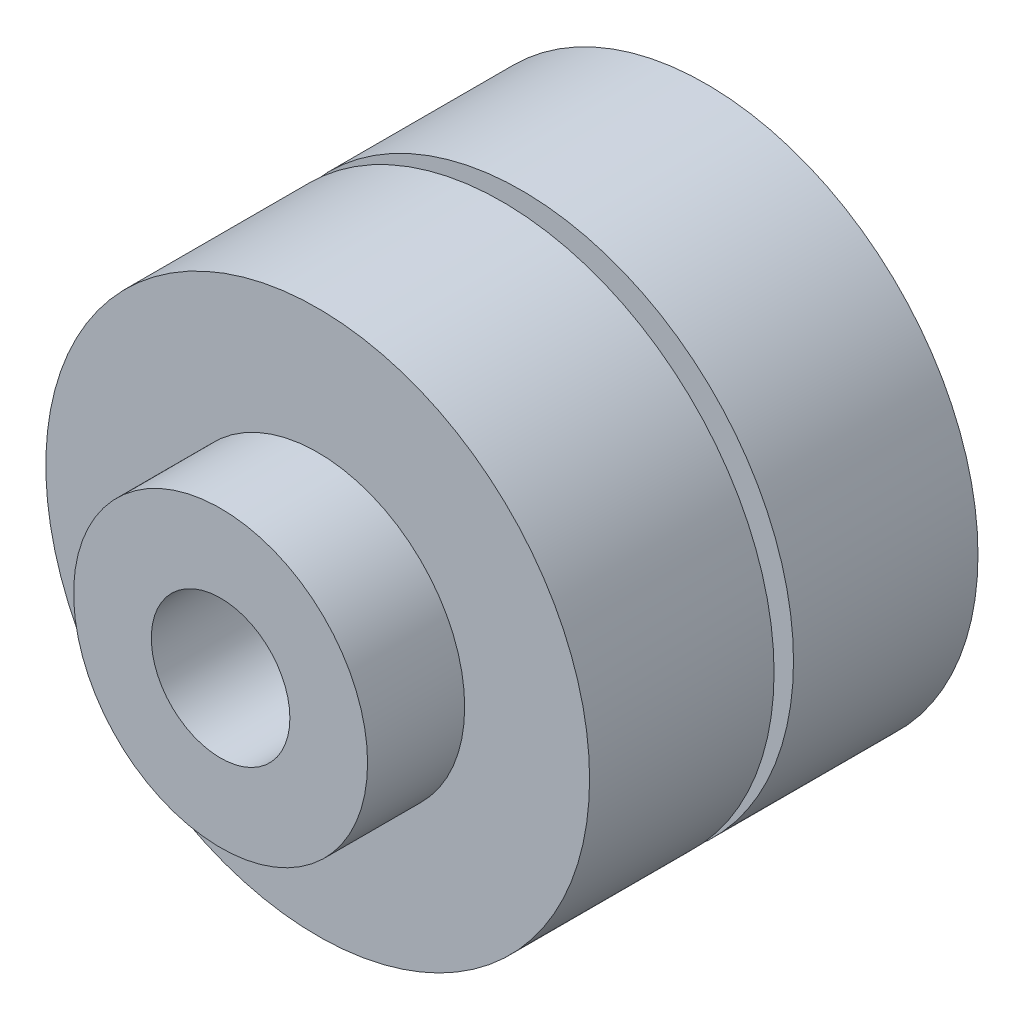
ISO-10303-21;
HEADER;
FILE_DESCRIPTION(('STEP AP214'),'2;1');
FILE_NAME('part.step','',(''),(''),'','','');
FILE_SCHEMA(('AUTOMOTIVE_DESIGN { 1 0 10303 214 1 1 1 1 }'));
ENDSEC;
DATA;
#1=APPLICATION_CONTEXT('core data for automotive mechanical design processes');
#2=APPLICATION_PROTOCOL_DEFINITION('international standard','automotive_design',2000,#1);
#3=PRODUCT_CONTEXT('',#1,'mechanical');
#4=PRODUCT('Part','Part','',(#3));
#5=PRODUCT_RELATED_PRODUCT_CATEGORY('part','',(#4));
#6=PRODUCT_DEFINITION_FORMATION('','',#4);
#7=PRODUCT_DEFINITION_CONTEXT('part definition',#1,'design');
#8=PRODUCT_DEFINITION('design','',#6,#7);
#9=PRODUCT_DEFINITION_SHAPE('','',#8);
#10=(LENGTH_UNIT() NAMED_UNIT(*) SI_UNIT(.MILLI.,.METRE.));
#11=(NAMED_UNIT(*) PLANE_ANGLE_UNIT() SI_UNIT($,.RADIAN.));
#12=(NAMED_UNIT(*) SI_UNIT($,.STERADIAN.) SOLID_ANGLE_UNIT());
#13=UNCERTAINTY_MEASURE_WITH_UNIT(LENGTH_MEASURE(1.E-05),#10,'distance_accuracy_value','');
#14=(GEOMETRIC_REPRESENTATION_CONTEXT(3) GLOBAL_UNCERTAINTY_ASSIGNED_CONTEXT((#13)) GLOBAL_UNIT_ASSIGNED_CONTEXT((#10,
#11,#12)) REPRESENTATION_CONTEXT('',''));
#15=CARTESIAN_POINT('',(0.,0.,0.));
#16=DIRECTION('',(0.,0.,1.));
#17=DIRECTION('',(1.,0.,0.));
#18=AXIS2_PLACEMENT_3D('',#15,#16,#17);
#19=CARTESIAN_POINT('',(-25.,0.,-60.));
#20=DIRECTION('',(0.,0.,1.));
#21=DIRECTION('',(1.,0.,0.));
#22=AXIS2_PLACEMENT_3D('',#19,#20,#21);
#23=PLANE('',#22);
#24=CARTESIAN_POINT('',(0.,0.,-60.));
#25=DIRECTION('',(0.,0.,1.));
#26=DIRECTION('',(1.,0.,0.));
#27=AXIS2_PLACEMENT_3D('',#24,#25,#26);
#28=CIRCLE('',#27,25.);
#29=CARTESIAN_POINT('',(25.,0.,-60.));
#30=VERTEX_POINT('',#29);
#31=EDGE_CURVE('E104',#30,#30,#28,.T.);
#32=ORIENTED_EDGE('',*,*,#31,.F.);
#33=EDGE_LOOP('',(#32));
#34=FACE_BOUND('',#33,.T.);
#35=CARTESIAN_POINT('',(0.,0.,-60.));
#36=DIRECTION('',(0.,0.,1.));
#37=DIRECTION('',(1.,0.,0.));
#38=AXIS2_PLACEMENT_3D('',#35,#36,#37);
#39=CIRCLE('',#38,5.00000000000009);
#40=CARTESIAN_POINT('',(5.00000000000009,0.,-60.));
#41=VERTEX_POINT('',#40);
#42=EDGE_CURVE('E10',#41,#41,#39,.T.);
#43=ORIENTED_EDGE('',*,*,#42,.T.);
#44=EDGE_LOOP('',(#43));
#45=FACE_BOUND('',#44,.T.);
#46=ADVANCED_FACE('F37',(#34,#45),#23,.F.);
#47=CARTESIAN_POINT('',(0.,0.,16.4130491248581));
#48=DIRECTION('',(0.,0.,1.));
#49=DIRECTION('',(1.,0.,0.));
#50=AXIS2_PLACEMENT_3D('',#47,#48,#49);
#51=CYLINDRICAL_SURFACE('',#50,5.00000000000009);
#52=ORIENTED_EDGE('',*,*,#42,.F.);
#53=EDGE_LOOP('',(#52));
#54=FACE_BOUND('',#53,.T.);
#55=CARTESIAN_POINT('',(0.,0.,-30.));
#56=DIRECTION('',(0.,0.,1.));
#57=DIRECTION('',(1.,0.,0.));
#58=AXIS2_PLACEMENT_3D('',#55,#56,#57);
#59=CIRCLE('',#58,5.0000000000001);
#60=CARTESIAN_POINT('',(5.0000000000001,0.,-30.));
#61=VERTEX_POINT('',#60);
#62=EDGE_CURVE('E44',#61,#61,#59,.T.);
#63=ORIENTED_EDGE('',*,*,#62,.T.);
#64=EDGE_LOOP('',(#63));
#65=FACE_BOUND('',#64,.T.);
#66=ADVANCED_FACE('F112',(#54,#65),#51,.F.);
#67=CARTESIAN_POINT('',(-5.0000000000001,0.,-30.));
#68=DIRECTION('',(0.,0.,-1.));
#69=DIRECTION('',(-1.,0.,0.));
#70=AXIS2_PLACEMENT_3D('',#67,#68,#69);
#71=PLANE('',#70);
#72=ORIENTED_EDGE('',*,*,#62,.F.);
#73=EDGE_LOOP('',(#72));
#74=FACE_BOUND('',#73,.T.);
#75=CARTESIAN_POINT('',(0.,0.,-30.));
#76=DIRECTION('',(0.,0.,1.));
#77=DIRECTION('',(1.,0.,0.));
#78=AXIS2_PLACEMENT_3D('',#75,#76,#77);
#79=CIRCLE('',#78,50.);
#80=CARTESIAN_POINT('',(50.,0.,-30.));
#81=VERTEX_POINT('',#80);
#82=EDGE_CURVE('E49',#81,#81,#79,.T.);
#83=ORIENTED_EDGE('',*,*,#82,.T.);
#84=EDGE_LOOP('',(#83));
#85=FACE_BOUND('',#84,.T.);
#86=ADVANCED_FACE('F116',(#74,#85),#71,.F.);
#87=CARTESIAN_POINT('',(0.,0.,16.4130491248581));
#88=DIRECTION('',(0.,0.,1.));
#89=DIRECTION('',(1.,0.,0.));
#90=AXIS2_PLACEMENT_3D('',#87,#88,#89);
#91=CYLINDRICAL_SURFACE('',#90,50.);
#92=ORIENTED_EDGE('',*,*,#82,.F.);
#93=EDGE_LOOP('',(#92));
#94=FACE_BOUND('',#93,.T.);
#95=CARTESIAN_POINT('',(0.,0.,30.));
#96=DIRECTION('',(0.,0.,1.));
#97=DIRECTION('',(1.,0.,0.));
#98=AXIS2_PLACEMENT_3D('',#95,#96,#97);
#99=CIRCLE('',#98,50.);
#100=CARTESIAN_POINT('',(50.,0.,30.));
#101=VERTEX_POINT('',#100);
#102=EDGE_CURVE('E54',#101,#101,#99,.T.);
#103=ORIENTED_EDGE('',*,*,#102,.T.);
#104=EDGE_LOOP('',(#103));
#105=FACE_BOUND('',#104,.T.);
#106=ADVANCED_FACE('F121',(#94,#105),#91,.F.);
#107=CARTESIAN_POINT('',(-50.,0.,30.));
#108=DIRECTION('',(0.,0.,1.));
#109=DIRECTION('',(1.,0.,0.));
#110=AXIS2_PLACEMENT_3D('',#107,#108,#109);
#111=PLANE('',#110);
#112=ORIENTED_EDGE('',*,*,#102,.F.);
#113=EDGE_LOOP('',(#112));
#114=FACE_BOUND('',#113,.T.);
#115=CARTESIAN_POINT('',(0.,0.,30.));
#116=DIRECTION('',(0.,0.,1.));
#117=DIRECTION('',(1.,0.,0.));
#118=AXIS2_PLACEMENT_3D('',#115,#116,#117);
#119=CIRCLE('',#118,17.8412411615277);
#120=CARTESIAN_POINT('',(17.8412411615277,0.,30.));
#121=VERTEX_POINT('',#120);
#122=EDGE_CURVE('E60',#121,#121,#119,.T.);
#123=ORIENTED_EDGE('',*,*,#122,.T.);
#124=EDGE_LOOP('',(#123));
#125=FACE_BOUND('',#124,.T.);
#126=ADVANCED_FACE('F127',(#114,#125),#111,.F.);
#127=CARTESIAN_POINT('',(0.,0.,16.4130491248581));
#128=DIRECTION('',(0.,0.,1.));
#129=DIRECTION('',(1.,0.,0.));
#130=AXIS2_PLACEMENT_3D('',#127,#128,#129);
#131=CYLINDRICAL_SURFACE('',#130,17.8412411615277);
#132=ORIENTED_EDGE('',*,*,#122,.F.);
#133=EDGE_LOOP('',(#132));
#134=FACE_BOUND('',#133,.T.);
#135=CARTESIAN_POINT('',(0.,0.,75.));
#136=DIRECTION('',(0.,0.,1.));
#137=DIRECTION('',(1.,0.,0.));
#138=AXIS2_PLACEMENT_3D('',#135,#136,#137);
#139=CIRCLE('',#138,17.8412411615276);
#140=CARTESIAN_POINT('',(17.8412411615276,0.,75.));
#141=VERTEX_POINT('',#140);
#142=EDGE_CURVE('E64',#141,#141,#139,.T.);
#143=ORIENTED_EDGE('',*,*,#142,.T.);
#144=EDGE_LOOP('',(#143));
#145=FACE_BOUND('',#144,.T.);
#146=ADVANCED_FACE('F131',(#134,#145),#131,.F.);
#147=CARTESIAN_POINT('',(-17.8412411615276,0.,75.));
#148=DIRECTION('',(0.,0.,-1.));
#149=DIRECTION('',(-1.,0.,0.));
#150=AXIS2_PLACEMENT_3D('',#147,#148,#149);
#151=PLANE('',#150);
#152=ORIENTED_EDGE('',*,*,#142,.F.);
#153=EDGE_LOOP('',(#152));
#154=FACE_BOUND('',#153,.T.);
#155=CARTESIAN_POINT('',(0.,0.,75.));
#156=DIRECTION('',(0.,0.,1.));
#157=DIRECTION('',(1.,0.,0.));
#158=AXIS2_PLACEMENT_3D('',#155,#156,#157);
#159=CIRCLE('',#158,37.8412411615276);
#160=CARTESIAN_POINT('',(37.8412411615276,0.,75.));
#161=VERTEX_POINT('',#160);
#162=EDGE_CURVE('E68',#161,#161,#159,.T.);
#163=ORIENTED_EDGE('',*,*,#162,.T.);
#164=EDGE_LOOP('',(#163));
#165=FACE_BOUND('',#164,.T.);
#166=ADVANCED_FACE('F135',(#154,#165),#151,.F.);
#167=CARTESIAN_POINT('',(0.,0.,16.4130491248581));
#168=DIRECTION('',(0.,0.,1.));
#169=DIRECTION('',(1.,0.,0.));
#170=AXIS2_PLACEMENT_3D('',#167,#168,#169);
#171=CYLINDRICAL_SURFACE('',#170,37.8412411615276);
#172=ORIENTED_EDGE('',*,*,#162,.F.);
#173=EDGE_LOOP('',(#172));
#174=FACE_BOUND('',#173,.T.);
#175=CARTESIAN_POINT('',(0.,0.,50.));
#176=DIRECTION('',(0.,0.,1.));
#177=DIRECTION('',(1.,0.,0.));
#178=AXIS2_PLACEMENT_3D('',#175,#176,#177);
#179=CIRCLE('',#178,37.8412411615276);
#180=CARTESIAN_POINT('',(37.8412411615276,0.,50.));
#181=VERTEX_POINT('',#180);
#182=EDGE_CURVE('E72',#181,#181,#179,.T.);
#183=ORIENTED_EDGE('',*,*,#182,.T.);
#184=EDGE_LOOP('',(#183));
#185=FACE_BOUND('',#184,.T.);
#186=ADVANCED_FACE('F139',(#174,#185),#171,.T.);
#187=CARTESIAN_POINT('',(-37.8412411615276,0.,50.));
#188=DIRECTION('',(0.,0.,-1.));
#189=DIRECTION('',(-1.,0.,0.));
#190=AXIS2_PLACEMENT_3D('',#187,#188,#189);
#191=PLANE('',#190);
#192=ORIENTED_EDGE('',*,*,#182,.F.);
#193=EDGE_LOOP('',(#192));
#194=FACE_BOUND('',#193,.T.);
#195=CARTESIAN_POINT('',(0.,0.,49.9999999999999));
#196=DIRECTION('',(0.,0.,1.));
#197=DIRECTION('',(1.,0.,0.));
#198=AXIS2_PLACEMENT_3D('',#195,#196,#197);
#199=CIRCLE('',#198,69.9999999999999);
#200=CARTESIAN_POINT('',(69.9999999999999,0.,49.9999999999999));
#201=VERTEX_POINT('',#200);
#202=EDGE_CURVE('E76',#201,#201,#199,.T.);
#203=ORIENTED_EDGE('',*,*,#202,.T.);
#204=EDGE_LOOP('',(#203));
#205=FACE_BOUND('',#204,.T.);
#206=ADVANCED_FACE('F143',(#194,#205),#191,.F.);
#207=CARTESIAN_POINT('',(0.,0.,16.4130491248581));
#208=DIRECTION('',(0.,0.,1.));
#209=DIRECTION('',(1.,0.,0.));
#210=AXIS2_PLACEMENT_3D('',#207,#208,#209);
#211=CYLINDRICAL_SURFACE('',#210,69.9999999999999);
#212=ORIENTED_EDGE('',*,*,#202,.F.);
#213=EDGE_LOOP('',(#212));
#214=FACE_BOUND('',#213,.T.);
#215=CARTESIAN_POINT('',(0.,0.,2.5));
#216=DIRECTION('',(0.,0.,1.));
#217=DIRECTION('',(1.,0.,0.));
#218=AXIS2_PLACEMENT_3D('',#215,#216,#217);
#219=CIRCLE('',#218,69.9999999999999);
#220=CARTESIAN_POINT('',(69.9999999999999,0.,2.5));
#221=VERTEX_POINT('',#220);
#222=EDGE_CURVE('E80',#221,#221,#219,.T.);
#223=ORIENTED_EDGE('',*,*,#222,.T.);
#224=EDGE_LOOP('',(#223));
#225=FACE_BOUND('',#224,.T.);
#226=ADVANCED_FACE('F147',(#214,#225),#211,.T.);
#227=CARTESIAN_POINT('',(-69.9999999999999,0.,2.5));
#228=DIRECTION('',(0.,0.,1.));
#229=DIRECTION('',(1.,0.,0.));
#230=AXIS2_PLACEMENT_3D('',#227,#228,#229);
#231=PLANE('',#230);
#232=ORIENTED_EDGE('',*,*,#222,.F.);
#233=EDGE_LOOP('',(#232));
#234=FACE_BOUND('',#233,.T.);
#235=CARTESIAN_POINT('',(0.,0.,2.5));
#236=DIRECTION('',(0.,0.,1.));
#237=DIRECTION('',(1.,0.,0.));
#238=AXIS2_PLACEMENT_3D('',#235,#236,#237);
#239=CIRCLE('',#238,55.);
#240=CARTESIAN_POINT('',(55.,0.,2.5));
#241=VERTEX_POINT('',#240);
#242=EDGE_CURVE('E84',#241,#241,#239,.T.);
#243=ORIENTED_EDGE('',*,*,#242,.T.);
#244=EDGE_LOOP('',(#243));
#245=FACE_BOUND('',#244,.T.);
#246=ADVANCED_FACE('F151',(#234,#245),#231,.F.);
#247=CARTESIAN_POINT('',(0.,0.,16.4130491248581));
#248=DIRECTION('',(0.,0.,1.));
#249=DIRECTION('',(1.,0.,0.));
#250=AXIS2_PLACEMENT_3D('',#247,#248,#249);
#251=CYLINDRICAL_SURFACE('',#250,55.);
#252=ORIENTED_EDGE('',*,*,#242,.F.);
#253=EDGE_LOOP('',(#252));
#254=FACE_BOUND('',#253,.T.);
#255=CARTESIAN_POINT('',(0.,0.,-2.5));
#256=DIRECTION('',(0.,0.,1.));
#257=DIRECTION('',(1.,0.,0.));
#258=AXIS2_PLACEMENT_3D('',#255,#256,#257);
#259=CIRCLE('',#258,55.);
#260=CARTESIAN_POINT('',(55.,0.,-2.5));
#261=VERTEX_POINT('',#260);
#262=EDGE_CURVE('E88',#261,#261,#259,.T.);
#263=ORIENTED_EDGE('',*,*,#262,.T.);
#264=EDGE_LOOP('',(#263));
#265=FACE_BOUND('',#264,.T.);
#266=ADVANCED_FACE('F155',(#254,#265),#251,.T.);
#267=CARTESIAN_POINT('',(-55.,0.,-2.5));
#268=DIRECTION('',(0.,0.,-1.));
#269=DIRECTION('',(-1.,0.,0.));
#270=AXIS2_PLACEMENT_3D('',#267,#268,#269);
#271=PLANE('',#270);
#272=ORIENTED_EDGE('',*,*,#262,.F.);
#273=EDGE_LOOP('',(#272));
#274=FACE_BOUND('',#273,.T.);
#275=CARTESIAN_POINT('',(0.,0.,-2.5));
#276=DIRECTION('',(0.,0.,1.));
#277=DIRECTION('',(1.,0.,0.));
#278=AXIS2_PLACEMENT_3D('',#275,#276,#277);
#279=CIRCLE('',#278,69.9999999999999);
#280=CARTESIAN_POINT('',(69.9999999999999,0.,-2.5));
#281=VERTEX_POINT('',#280);
#282=EDGE_CURVE('E92',#281,#281,#279,.T.);
#283=ORIENTED_EDGE('',*,*,#282,.T.);
#284=EDGE_LOOP('',(#283));
#285=FACE_BOUND('',#284,.T.);
#286=ADVANCED_FACE('F159',(#274,#285),#271,.F.);
#287=CARTESIAN_POINT('',(0.,0.,16.4130491248581));
#288=DIRECTION('',(0.,0.,1.));
#289=DIRECTION('',(1.,0.,0.));
#290=AXIS2_PLACEMENT_3D('',#287,#288,#289);
#291=CYLINDRICAL_SURFACE('',#290,69.9999999999999);
#292=ORIENTED_EDGE('',*,*,#282,.F.);
#293=EDGE_LOOP('',(#292));
#294=FACE_BOUND('',#293,.T.);
#295=CARTESIAN_POINT('',(0.,0.,-49.9999999999999));
#296=DIRECTION('',(0.,0.,1.));
#297=DIRECTION('',(1.,0.,0.));
#298=AXIS2_PLACEMENT_3D('',#295,#296,#297);
#299=CIRCLE('',#298,70.);
#300=CARTESIAN_POINT('',(70.,0.,-49.9999999999999));
#301=VERTEX_POINT('',#300);
#302=EDGE_CURVE('E96',#301,#301,#299,.T.);
#303=ORIENTED_EDGE('',*,*,#302,.T.);
#304=EDGE_LOOP('',(#303));
#305=FACE_BOUND('',#304,.T.);
#306=ADVANCED_FACE('F163',(#294,#305),#291,.T.);
#307=CARTESIAN_POINT('',(-70.,0.,-49.9999999999999));
#308=DIRECTION('',(0.,0.,1.));
#309=DIRECTION('',(1.,0.,0.));
#310=AXIS2_PLACEMENT_3D('',#307,#308,#309);
#311=PLANE('',#310);
#312=ORIENTED_EDGE('',*,*,#302,.F.);
#313=EDGE_LOOP('',(#312));
#314=FACE_BOUND('',#313,.T.);
#315=CARTESIAN_POINT('',(0.,0.,-49.9999999999999));
#316=DIRECTION('',(0.,0.,1.));
#317=DIRECTION('',(1.,0.,0.));
#318=AXIS2_PLACEMENT_3D('',#315,#316,#317);
#319=CIRCLE('',#318,25.);
#320=CARTESIAN_POINT('',(25.,0.,-49.9999999999999));
#321=VERTEX_POINT('',#320);
#322=EDGE_CURVE('E100',#321,#321,#319,.T.);
#323=ORIENTED_EDGE('',*,*,#322,.T.);
#324=EDGE_LOOP('',(#323));
#325=FACE_BOUND('',#324,.T.);
#326=ADVANCED_FACE('F167',(#314,#325),#311,.F.);
#327=CARTESIAN_POINT('',(0.,0.,16.4130491248581));
#328=DIRECTION('',(0.,0.,1.));
#329=DIRECTION('',(1.,0.,0.));
#330=AXIS2_PLACEMENT_3D('',#327,#328,#329);
#331=CYLINDRICAL_SURFACE('',#330,25.);
#332=ORIENTED_EDGE('',*,*,#322,.F.);
#333=EDGE_LOOP('',(#332));
#334=FACE_BOUND('',#333,.T.);
#335=ORIENTED_EDGE('',*,*,#31,.T.);
#336=EDGE_LOOP('',(#335));
#337=FACE_BOUND('',#336,.T.);
#338=ADVANCED_FACE('F109',(#334,#337),#331,.T.);
#339=CLOSED_SHELL('',(#46,#66,#86,#106,#126,#146,#166,#186,#206,#226,#246,#266,#286,#306,#326,#338));
#340=MANIFOLD_SOLID_BREP('B2',#339);
#341=ADVANCED_BREP_SHAPE_REPRESENTATION('',(#18,#340),#14);
#342=SHAPE_DEFINITION_REPRESENTATION(#9,#341);
ENDSEC;
END-ISO-10303-21;
